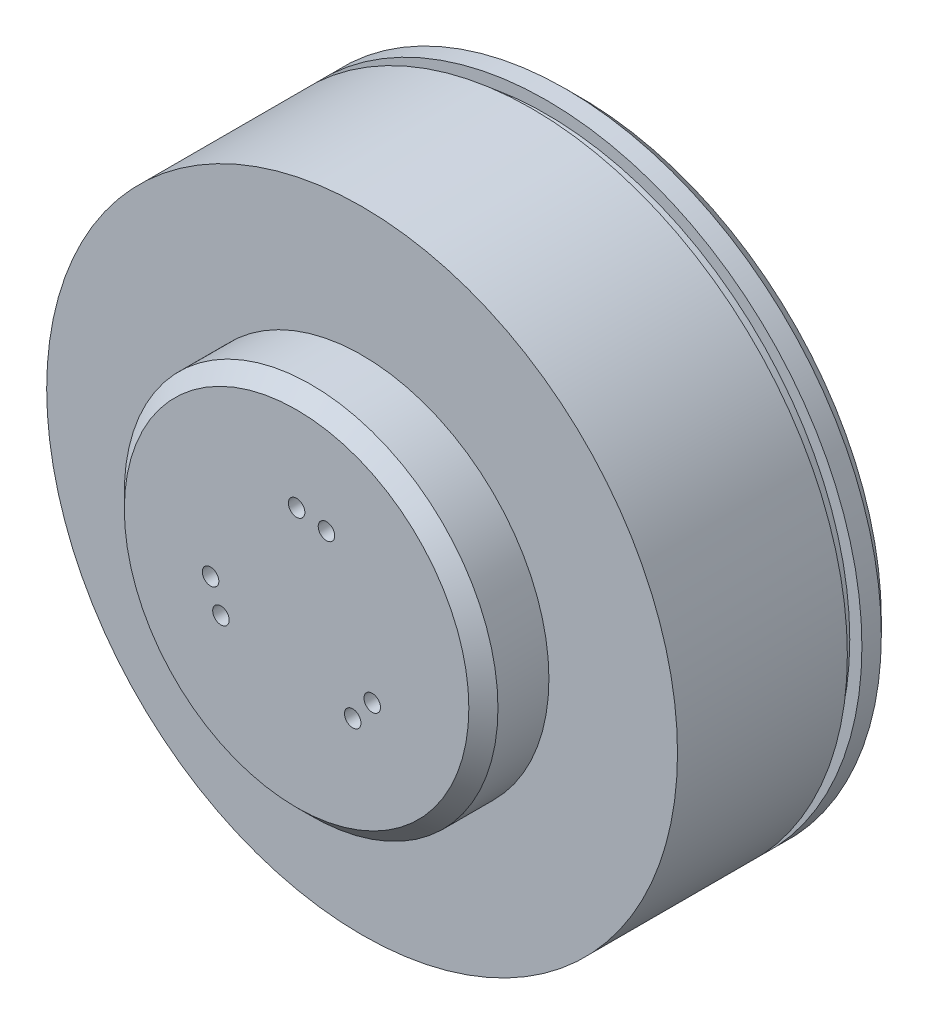
ISO-10303-21;
HEADER;
FILE_DESCRIPTION(('STEP AP214'),'2;1');
FILE_NAME('part.step','',(''),(''),'','','');
FILE_SCHEMA(('AUTOMOTIVE_DESIGN { 1 0 10303 214 1 1 1 1 }'));
ENDSEC;
DATA;
#1=APPLICATION_CONTEXT('core data for automotive mechanical design processes');
#2=APPLICATION_PROTOCOL_DEFINITION('international standard','automotive_design',2000,#1);
#3=PRODUCT_CONTEXT('',#1,'mechanical');
#4=PRODUCT('Part','Part','',(#3));
#5=PRODUCT_RELATED_PRODUCT_CATEGORY('part','',(#4));
#6=PRODUCT_DEFINITION_FORMATION('','',#4);
#7=PRODUCT_DEFINITION_CONTEXT('part definition',#1,'design');
#8=PRODUCT_DEFINITION('design','',#6,#7);
#9=PRODUCT_DEFINITION_SHAPE('','',#8);
#10=(LENGTH_UNIT() NAMED_UNIT(*) SI_UNIT(.MILLI.,.METRE.));
#11=(NAMED_UNIT(*) PLANE_ANGLE_UNIT() SI_UNIT($,.RADIAN.));
#12=(NAMED_UNIT(*) SI_UNIT($,.STERADIAN.) SOLID_ANGLE_UNIT());
#13=UNCERTAINTY_MEASURE_WITH_UNIT(LENGTH_MEASURE(1.E-05),#10,'distance_accuracy_value','');
#14=(GEOMETRIC_REPRESENTATION_CONTEXT(3) GLOBAL_UNCERTAINTY_ASSIGNED_CONTEXT((#13)) GLOBAL_UNIT_ASSIGNED_CONTEXT((#10,
#11,#12)) REPRESENTATION_CONTEXT('',''));
#15=CARTESIAN_POINT('',(0.,0.,0.));
#16=DIRECTION('',(0.,0.,1.));
#17=DIRECTION('',(1.,0.,0.));
#18=AXIS2_PLACEMENT_3D('',#15,#16,#17);
#19=CARTESIAN_POINT('',(-34.4262768246609,1.32819918815126,-286.610981847008));
#20=DIRECTION('',(0.,0.,-1.));
#21=DIRECTION('',(-1.,0.,0.));
#22=AXIS2_PLACEMENT_3D('',#19,#20,#21);
#23=CYLINDRICAL_SURFACE('',#22,130.);
#24=CARTESIAN_POINT('',(-34.4262768246609,1.32819918815126,-370.611081847008));
#25=DIRECTION('',(0.,0.,-1.));
#26=DIRECTION('',(-1.,0.,0.));
#27=AXIS2_PLACEMENT_3D('',#24,#25,#26);
#28=CIRCLE('',#27,130.);
#29=CARTESIAN_POINT('',(-164.426276824661,1.32819918815126,-370.611081847008));
#30=VERTEX_POINT('',#29);
#31=EDGE_CURVE('E11',#30,#30,#28,.F.);
#32=ORIENTED_EDGE('',*,*,#31,.T.);
#33=EDGE_LOOP('',(#32));
#34=FACE_BOUND('',#33,.T.);
#35=CARTESIAN_POINT('',(-34.4262768246609,1.32819918815126,-362.611081847008));
#36=DIRECTION('',(0.,0.,-1.));
#37=DIRECTION('',(-1.,0.,0.));
#38=AXIS2_PLACEMENT_3D('',#35,#36,#37);
#39=CIRCLE('',#38,130.);
#40=CARTESIAN_POINT('',(-164.426276824661,1.32819918815126,-362.611081847008));
#41=VERTEX_POINT('',#40);
#42=EDGE_CURVE('E126',#41,#41,#39,.T.);
#43=ORIENTED_EDGE('',*,*,#42,.T.);
#44=EDGE_LOOP('',(#43));
#45=FACE_BOUND('',#44,.T.);
#46=ADVANCED_FACE('F41',(#34,#45),#23,.T.);
#47=CARTESIAN_POINT('',(-34.4262768246609,1.32819918815126,-376.611081847008));
#48=DIRECTION('',(0.,0.,-1.));
#49=DIRECTION('',(-1.,0.,0.));
#50=AXIS2_PLACEMENT_3D('',#47,#48,#49);
#51=PLANE('',#50);
#52=CARTESIAN_POINT('',(-34.4262768246609,1.32819918815126,-376.611081847008));
#53=DIRECTION('',(0.,0.,-1.));
#54=DIRECTION('',(-1.,0.,0.));
#55=AXIS2_PLACEMENT_3D('',#52,#53,#54);
#56=CIRCLE('',#55,124.);
#57=CARTESIAN_POINT('',(-158.426276824661,1.32819918815126,-376.611081847008));
#58=VERTEX_POINT('',#57);
#59=EDGE_CURVE('E50',#58,#58,#56,.T.);
#60=ORIENTED_EDGE('',*,*,#59,.T.);
#61=EDGE_LOOP('',(#60));
#62=FACE_BOUND('',#61,.T.);
#63=ADVANCED_FACE('F140',(#62),#51,.T.);
#64=CARTESIAN_POINT('',(-34.4262768246609,1.32819918815126,-362.611081847008));
#65=DIRECTION('',(0.,0.,-1.));
#66=DIRECTION('',(-1.,0.,0.));
#67=AXIS2_PLACEMENT_3D('',#64,#65,#66);
#68=PLANE('',#67);
#69=ORIENTED_EDGE('',*,*,#42,.F.);
#70=EDGE_LOOP('',(#69));
#71=FACE_BOUND('',#70,.T.);
#72=CARTESIAN_POINT('',(-34.4262768246608,1.3281991881513,-362.611081847008));
#73=DIRECTION('',(0.,0.,-1.));
#74=DIRECTION('',(-1.,0.,0.));
#75=AXIS2_PLACEMENT_3D('',#72,#73,#74);
#76=CIRCLE('',#75,125.);
#77=CARTESIAN_POINT('',(-159.426276824661,1.3281991881513,-362.611081847008));
#78=VERTEX_POINT('',#77);
#79=EDGE_CURVE('E120',#78,#78,#76,.T.);
#80=ORIENTED_EDGE('',*,*,#79,.T.);
#81=EDGE_LOOP('',(#80));
#82=FACE_BOUND('',#81,.T.);
#83=ADVANCED_FACE('F157',(#71,#82),#68,.F.);
#84=CARTESIAN_POINT('',(-34.4262768246609,1.32819918815126,-356.611081847008));
#85=DIRECTION('',(0.,0.,-1.));
#86=DIRECTION('',(-1.,0.,0.));
#87=AXIS2_PLACEMENT_3D('',#84,#85,#86);
#88=PLANE('',#87);
#89=CARTESIAN_POINT('',(-34.4262768246609,1.32819918815126,-356.611081847008));
#90=DIRECTION('',(0.,0.,-1.));
#91=DIRECTION('',(-1.,0.,0.));
#92=AXIS2_PLACEMENT_3D('',#89,#90,#91);
#93=CIRCLE('',#92,130.);
#94=CARTESIAN_POINT('',(-164.426276824661,1.32819918815126,-356.611081847008));
#95=VERTEX_POINT('',#94);
#96=EDGE_CURVE('E123',#95,#95,#93,.T.);
#97=ORIENTED_EDGE('',*,*,#96,.T.);
#98=EDGE_LOOP('',(#97));
#99=FACE_BOUND('',#98,.T.);
#100=CARTESIAN_POINT('',(-34.4262768246608,1.3281991881513,-356.611081847008));
#101=DIRECTION('',(0.,0.,-1.));
#102=DIRECTION('',(-1.,0.,0.));
#103=AXIS2_PLACEMENT_3D('',#100,#101,#102);
#104=CIRCLE('',#103,125.);
#105=CARTESIAN_POINT('',(-159.426276824661,1.3281991881513,-356.611081847008));
#106=VERTEX_POINT('',#105);
#107=EDGE_CURVE('E114',#106,#106,#104,.T.);
#108=ORIENTED_EDGE('',*,*,#107,.F.);
#109=EDGE_LOOP('',(#108));
#110=FACE_BOUND('',#109,.T.);
#111=ADVANCED_FACE('F178',(#99,#110),#88,.T.);
#112=CARTESIAN_POINT('',(-34.4262768246608,1.3281991881513,-362.611081847008));
#113=DIRECTION('',(0.,0.,1.));
#114=DIRECTION('',(1.,0.,0.));
#115=AXIS2_PLACEMENT_3D('',#112,#113,#114);
#116=CYLINDRICAL_SURFACE('',#115,125.);
#117=ORIENTED_EDGE('',*,*,#79,.F.);
#118=EDGE_LOOP('',(#117));
#119=FACE_BOUND('',#118,.T.);
#120=ORIENTED_EDGE('',*,*,#107,.T.);
#121=EDGE_LOOP('',(#120));
#122=FACE_BOUND('',#121,.T.);
#123=ADVANCED_FACE('F172',(#119,#122),#116,.T.);
#124=CARTESIAN_POINT('',(-34.4262768246609,1.32819918815126,-286.610981847008));
#125=DIRECTION('',(0.,0.,-1.));
#126=DIRECTION('',(-1.,0.,0.));
#127=AXIS2_PLACEMENT_3D('',#124,#125,#126);
#128=PLANE('',#127);
#129=CARTESIAN_POINT('',(-34.4262768246608,1.3281991881513,-286.610981847008));
#130=DIRECTION('',(0.,0.,1.));
#131=DIRECTION('',(1.,0.,0.));
#132=AXIS2_PLACEMENT_3D('',#129,#130,#131);
#133=CIRCLE('',#132,77.);
#134=CARTESIAN_POINT('',(42.5737231753392,1.3281991881513,-286.610981847008));
#135=VERTEX_POINT('',#134);
#136=EDGE_CURVE('E115',#135,#135,#133,.T.);
#137=ORIENTED_EDGE('',*,*,#136,.F.);
#138=EDGE_LOOP('',(#137));
#139=FACE_BOUND('',#138,.T.);
#140=CARTESIAN_POINT('',(-34.4262768246609,1.32819918815126,-286.610981847008));
#141=DIRECTION('',(0.,0.,-1.));
#142=DIRECTION('',(-1.,0.,0.));
#143=AXIS2_PLACEMENT_3D('',#140,#141,#142);
#144=CIRCLE('',#143,130.);
#145=CARTESIAN_POINT('',(-164.426276824661,1.32819918815126,-286.610981847008));
#146=VERTEX_POINT('',#145);
#147=EDGE_CURVE('E119',#146,#146,#144,.T.);
#148=ORIENTED_EDGE('',*,*,#147,.F.);
#149=EDGE_LOOP('',(#148));
#150=FACE_BOUND('',#149,.T.);
#151=ADVANCED_FACE('F163',(#139,#150),#128,.F.);
#152=ORIENTED_EDGE('',*,*,#147,.T.);
#153=EDGE_LOOP('',(#152));
#154=FACE_BOUND('',#153,.T.);
#155=ORIENTED_EDGE('',*,*,#96,.F.);
#156=EDGE_LOOP('',(#155));
#157=FACE_BOUND('',#156,.T.);
#158=ADVANCED_FACE('F153',(#154,#157),#23,.T.);
#159=CARTESIAN_POINT('',(-34.4262768246608,1.3281991881513,-41.8221932415516));
#160=DIRECTION('',(0.,0.,-1.));
#161=DIRECTION('',(-1.,0.,0.));
#162=AXIS2_PLACEMENT_3D('',#159,#160,#161);
#163=CYLINDRICAL_SURFACE('',#162,77.);
#164=CARTESIAN_POINT('',(-34.4262768246608,1.3281991881513,-265.611081847008));
#165=DIRECTION('',(0.,0.,1.));
#166=DIRECTION('',(1.,0.,0.));
#167=AXIS2_PLACEMENT_3D('',#164,#165,#166);
#168=CIRCLE('',#167,77.);
#169=CARTESIAN_POINT('',(42.5737231753392,1.3281991881513,-265.611081847008));
#170=VERTEX_POINT('',#169);
#171=EDGE_CURVE('E135',#170,#170,#168,.F.);
#172=ORIENTED_EDGE('',*,*,#171,.T.);
#173=EDGE_LOOP('',(#172));
#174=FACE_BOUND('',#173,.T.);
#175=ORIENTED_EDGE('',*,*,#136,.T.);
#176=EDGE_LOOP('',(#175));
#177=FACE_BOUND('',#176,.T.);
#178=ADVANCED_FACE('F162',(#174,#177),#163,.T.);
#179=CARTESIAN_POINT('',(-34.426276824661,1.3281991881512,-259.611081847008));
#180=DIRECTION('',(0.,0.,1.));
#181=DIRECTION('',(0.142159037104617,0.989843830192161,0.));
#182=AXIS2_PLACEMENT_3D('',#179,#180,#181);
#183=PLANE('',#182);
#184=CARTESIAN_POINT('',(-34.4262768246608,1.3281991881513,-259.611081847008));
#185=DIRECTION('',(0.,0.,1.));
#186=DIRECTION('',(1.,0.,0.));
#187=AXIS2_PLACEMENT_3D('',#184,#185,#186);
#188=CIRCLE('',#187,70.9999999999999);
#189=CARTESIAN_POINT('',(36.5737231753391,1.3281991881513,-259.611081847008));
#190=VERTEX_POINT('',#189);
#191=EDGE_CURVE('E118',#190,#190,#188,.T.);
#192=ORIENTED_EDGE('',*,*,#191,.T.);
#193=EDGE_LOOP('',(#192));
#194=FACE_BOUND('',#193,.T.);
#195=CARTESIAN_POINT('',(-34.4262768246608,37.3281991881513,-259.611081847008));
#196=DIRECTION('',(0.,0.,1.));
#197=DIRECTION('',(1.,0.,0.));
#198=AXIS2_PLACEMENT_3D('',#195,#196,#197);
#199=CIRCLE('',#198,3.4);
#200=CARTESIAN_POINT('',(-31.0262768246608,37.3281991881513,-259.611081847008));
#201=VERTEX_POINT('',#200);
#202=EDGE_CURVE('E80',#201,#201,#199,.T.);
#203=ORIENTED_EDGE('',*,*,#202,.F.);
#204=EDGE_LOOP('',(#203));
#205=FACE_BOUND('',#204,.T.);
#206=CARTESIAN_POINT('',(-22.1135516649436,35.1571335364465,-259.611081847008));
#207=DIRECTION('',(0.,0.,1.));
#208=DIRECTION('',(1.,0.,0.));
#209=AXIS2_PLACEMENT_3D('',#206,#207,#208);
#210=CIRCLE('',#209,3.4);
#211=CARTESIAN_POINT('',(-18.7135516649436,35.1571335364465,-259.611081847008));
#212=VERTEX_POINT('',#211);
#213=EDGE_CURVE('E79',#212,#212,#210,.T.);
#214=ORIENTED_EDGE('',*,*,#213,.F.);
#215=EDGE_LOOP('',(#214));
#216=FACE_BOUND('',#215,.T.);
#217=CARTESIAN_POINT('',(-3.24936228841936,-16.6718008118486,-259.611081847008));
#218=DIRECTION('',(0.,0.,1.));
#219=DIRECTION('',(1.,0.,0.));
#220=AXIS2_PLACEMENT_3D('',#217,#218,#219);
#221=CIRCLE('',#220,3.4);
#222=CARTESIAN_POINT('',(0.15063771158064,-16.6718008118486,-259.611081847008));
#223=VERTEX_POINT('',#222);
#224=EDGE_CURVE('E90',#223,#223,#221,.T.);
#225=ORIENTED_EDGE('',*,*,#224,.F.);
#226=EDGE_LOOP('',(#225));
#227=FACE_BOUND('',#226,.T.);
#228=CARTESIAN_POINT('',(-11.2859228759382,-26.249400764127,-259.611081847008));
#229=DIRECTION('',(0.,0.,1.));
#230=DIRECTION('',(1.,0.,0.));
#231=AXIS2_PLACEMENT_3D('',#228,#229,#230);
#232=CIRCLE('',#231,3.4);
#233=CARTESIAN_POINT('',(-7.88592287593818,-26.249400764127,-259.611081847008));
#234=VERTEX_POINT('',#233);
#235=EDGE_CURVE('E96',#234,#234,#232,.T.);
#236=ORIENTED_EDGE('',*,*,#235,.F.);
#237=EDGE_LOOP('',(#236));
#238=FACE_BOUND('',#237,.T.);
#239=CARTESIAN_POINT('',(-65.6031913608997,-16.6718008118498,-259.611081847008));
#240=DIRECTION('',(0.,0.,1.));
#241=DIRECTION('',(1.,0.,0.));
#242=AXIS2_PLACEMENT_3D('',#239,#240,#241);
#243=CIRCLE('',#242,3.4);
#244=CARTESIAN_POINT('',(-62.2031913608997,-16.6718008118498,-259.611081847008));
#245=VERTEX_POINT('',#244);
#246=EDGE_CURVE('E102',#245,#245,#243,.T.);
#247=ORIENTED_EDGE('',*,*,#246,.F.);
#248=EDGE_LOOP('',(#247));
#249=FACE_BOUND('',#248,.T.);
#250=CARTESIAN_POINT('',(-69.879355933098,-4.9231352078664,-259.611081847008));
#251=DIRECTION('',(0.,0.,1.));
#252=DIRECTION('',(1.,0.,0.));
#253=AXIS2_PLACEMENT_3D('',#250,#251,#252);
#254=CIRCLE('',#253,3.4);
#255=CARTESIAN_POINT('',(-66.479355933098,-4.9231352078664,-259.611081847008));
#256=VERTEX_POINT('',#255);
#257=EDGE_CURVE('E108',#256,#256,#254,.T.);
#258=ORIENTED_EDGE('',*,*,#257,.F.);
#259=EDGE_LOOP('',(#258));
#260=FACE_BOUND('',#259,.T.);
#261=ADVANCED_FACE('F169',(#194,#205,#216,#227,#238,#249,#260),#183,.T.);
#262=CARTESIAN_POINT('',(-69.879355933098,-4.9231352078664,-279.361081847008));
#263=DIRECTION('',(0.,0.,1.));
#264=DIRECTION('',(1.,0.,0.));
#265=AXIS2_PLACEMENT_3D('',#262,#263,#264);
#266=CONICAL_SURFACE('',#265,3.4,1.02974425867666);
#267=CARTESIAN_POINT('',(-69.879355933098,-4.9231352078664,-281.404007951702));
#268=VERTEX_POINT('',#267);
#269=VERTEX_LOOP('',#268);
#270=FACE_BOUND('',#269,.T.);
#271=CARTESIAN_POINT('',(-69.879355933098,-4.9231352078664,-279.361081847008));
#272=DIRECTION('',(0.,0.,1.));
#273=DIRECTION('',(1.,0.,0.));
#274=AXIS2_PLACEMENT_3D('',#271,#272,#273);
#275=CIRCLE('',#274,3.4);
#276=CARTESIAN_POINT('',(-66.479355933098,-4.9231352078664,-279.361081847008));
#277=VERTEX_POINT('',#276);
#278=EDGE_CURVE('E111',#277,#277,#275,.T.);
#279=ORIENTED_EDGE('',*,*,#278,.T.);
#280=EDGE_LOOP('',(#279));
#281=FACE_BOUND('',#280,.T.);
#282=ADVANCED_FACE('F226',(#270,#281),#266,.F.);
#283=CARTESIAN_POINT('',(-69.879355933098,-4.9231352078664,-259.611081847008));
#284=DIRECTION('',(0.,0.,1.));
#285=DIRECTION('',(1.,0.,0.));
#286=AXIS2_PLACEMENT_3D('',#283,#284,#285);
#287=CYLINDRICAL_SURFACE('',#286,3.4);
#288=ORIENTED_EDGE('',*,*,#278,.F.);
#289=EDGE_LOOP('',(#288));
#290=FACE_BOUND('',#289,.T.);
#291=ORIENTED_EDGE('',*,*,#257,.T.);
#292=EDGE_LOOP('',(#291));
#293=FACE_BOUND('',#292,.T.);
#294=ADVANCED_FACE('F231',(#290,#293),#287,.F.);
#295=CARTESIAN_POINT('',(-65.6031913608997,-16.6718008118498,-279.361081847008));
#296=DIRECTION('',(0.,0.,1.));
#297=DIRECTION('',(1.,0.,0.));
#298=AXIS2_PLACEMENT_3D('',#295,#296,#297);
#299=CONICAL_SURFACE('',#298,3.39999999999999,1.02974425867665);
#300=CARTESIAN_POINT('',(-65.6031913608997,-16.6718008118498,-281.404007951702));
#301=VERTEX_POINT('',#300);
#302=VERTEX_LOOP('',#301);
#303=FACE_BOUND('',#302,.T.);
#304=CARTESIAN_POINT('',(-65.6031913608997,-16.6718008118498,-279.361081847008));
#305=DIRECTION('',(0.,0.,1.));
#306=DIRECTION('',(1.,0.,0.));
#307=AXIS2_PLACEMENT_3D('',#304,#305,#306);
#308=CIRCLE('',#307,3.39999999999999);
#309=CARTESIAN_POINT('',(-62.2031913608997,-16.6718008118498,-279.361081847008));
#310=VERTEX_POINT('',#309);
#311=EDGE_CURVE('E105',#310,#310,#308,.T.);
#312=ORIENTED_EDGE('',*,*,#311,.T.);
#313=EDGE_LOOP('',(#312));
#314=FACE_BOUND('',#313,.T.);
#315=ADVANCED_FACE('F243',(#303,#314),#299,.F.);
#316=CARTESIAN_POINT('',(-65.6031913608997,-16.6718008118498,-259.611081847008));
#317=DIRECTION('',(0.,0.,1.));
#318=DIRECTION('',(1.,0.,0.));
#319=AXIS2_PLACEMENT_3D('',#316,#317,#318);
#320=CYLINDRICAL_SURFACE('',#319,3.4);
#321=ORIENTED_EDGE('',*,*,#311,.F.);
#322=EDGE_LOOP('',(#321));
#323=FACE_BOUND('',#322,.T.);
#324=ORIENTED_EDGE('',*,*,#246,.T.);
#325=EDGE_LOOP('',(#324));
#326=FACE_BOUND('',#325,.T.);
#327=ADVANCED_FACE('F256',(#323,#326),#320,.F.);
#328=CARTESIAN_POINT('',(-11.2859228759382,-26.249400764127,-279.361081847008));
#329=DIRECTION('',(0.,0.,1.));
#330=DIRECTION('',(1.,0.,0.));
#331=AXIS2_PLACEMENT_3D('',#328,#329,#330);
#332=CONICAL_SURFACE('',#331,3.39999999999999,1.02974425867665);
#333=CARTESIAN_POINT('',(-11.2859228759382,-26.249400764127,-281.404007951702));
#334=VERTEX_POINT('',#333);
#335=VERTEX_LOOP('',#334);
#336=FACE_BOUND('',#335,.T.);
#337=CARTESIAN_POINT('',(-11.2859228759382,-26.249400764127,-279.361081847008));
#338=DIRECTION('',(0.,0.,1.));
#339=DIRECTION('',(1.,0.,0.));
#340=AXIS2_PLACEMENT_3D('',#337,#338,#339);
#341=CIRCLE('',#340,3.39999999999999);
#342=CARTESIAN_POINT('',(-7.88592287593819,-26.249400764127,-279.361081847008));
#343=VERTEX_POINT('',#342);
#344=EDGE_CURVE('E99',#343,#343,#341,.T.);
#345=ORIENTED_EDGE('',*,*,#344,.T.);
#346=EDGE_LOOP('',(#345));
#347=FACE_BOUND('',#346,.T.);
#348=ADVANCED_FACE('F265',(#336,#347),#332,.F.);
#349=CARTESIAN_POINT('',(-11.2859228759382,-26.249400764127,-259.611081847008));
#350=DIRECTION('',(0.,0.,1.));
#351=DIRECTION('',(1.,0.,0.));
#352=AXIS2_PLACEMENT_3D('',#349,#350,#351);
#353=CYLINDRICAL_SURFACE('',#352,3.4);
#354=ORIENTED_EDGE('',*,*,#344,.F.);
#355=EDGE_LOOP('',(#354));
#356=FACE_BOUND('',#355,.T.);
#357=ORIENTED_EDGE('',*,*,#235,.T.);
#358=EDGE_LOOP('',(#357));
#359=FACE_BOUND('',#358,.T.);
#360=ADVANCED_FACE('F277',(#356,#359),#353,.F.);
#361=CARTESIAN_POINT('',(-3.24936228841936,-16.6718008118486,-279.361081847008));
#362=DIRECTION('',(0.,0.,1.));
#363=DIRECTION('',(1.,0.,0.));
#364=AXIS2_PLACEMENT_3D('',#361,#362,#363);
#365=CONICAL_SURFACE('',#364,3.39999999999999,1.02974425867665);
#366=CARTESIAN_POINT('',(-3.24936228841936,-16.6718008118486,-281.404007951702));
#367=VERTEX_POINT('',#366);
#368=VERTEX_LOOP('',#367);
#369=FACE_BOUND('',#368,.T.);
#370=CARTESIAN_POINT('',(-3.24936228841936,-16.6718008118486,-279.361081847008));
#371=DIRECTION('',(0.,0.,1.));
#372=DIRECTION('',(1.,0.,0.));
#373=AXIS2_PLACEMENT_3D('',#370,#371,#372);
#374=CIRCLE('',#373,3.39999999999999);
#375=CARTESIAN_POINT('',(0.150637711580638,-16.6718008118486,-279.361081847008));
#376=VERTEX_POINT('',#375);
#377=EDGE_CURVE('E93',#376,#376,#374,.T.);
#378=ORIENTED_EDGE('',*,*,#377,.T.);
#379=EDGE_LOOP('',(#378));
#380=FACE_BOUND('',#379,.T.);
#381=ADVANCED_FACE('F287',(#369,#380),#365,.F.);
#382=CARTESIAN_POINT('',(-3.24936228841936,-16.6718008118486,-259.611081847008));
#383=DIRECTION('',(0.,0.,1.));
#384=DIRECTION('',(1.,0.,0.));
#385=AXIS2_PLACEMENT_3D('',#382,#383,#384);
#386=CYLINDRICAL_SURFACE('',#385,3.4);
#387=ORIENTED_EDGE('',*,*,#377,.F.);
#388=EDGE_LOOP('',(#387));
#389=FACE_BOUND('',#388,.T.);
#390=ORIENTED_EDGE('',*,*,#224,.T.);
#391=EDGE_LOOP('',(#390));
#392=FACE_BOUND('',#391,.T.);
#393=ADVANCED_FACE('F299',(#389,#392),#386,.F.);
#394=CARTESIAN_POINT('',(-22.1135516649436,35.1571335364465,-279.361081847008));
#395=DIRECTION('',(0.,0.,1.));
#396=DIRECTION('',(1.,0.,0.));
#397=AXIS2_PLACEMENT_3D('',#394,#395,#396);
#398=CONICAL_SURFACE('',#397,3.39999999999999,1.02974425867665);
#399=CARTESIAN_POINT('',(-22.1135516649436,35.1571335364465,-281.404007951702));
#400=VERTEX_POINT('',#399);
#401=VERTEX_LOOP('',#400);
#402=FACE_BOUND('',#401,.T.);
#403=CARTESIAN_POINT('',(-22.1135516649436,35.1571335364465,-279.361081847008));
#404=DIRECTION('',(0.,0.,1.));
#405=DIRECTION('',(1.,0.,0.));
#406=AXIS2_PLACEMENT_3D('',#403,#404,#405);
#407=CIRCLE('',#406,3.39999999999999);
#408=CARTESIAN_POINT('',(-18.7135516649436,35.1571335364465,-279.361081847008));
#409=VERTEX_POINT('',#408);
#410=EDGE_CURVE('E83',#409,#409,#407,.T.);
#411=ORIENTED_EDGE('',*,*,#410,.T.);
#412=EDGE_LOOP('',(#411));
#413=FACE_BOUND('',#412,.T.);
#414=ADVANCED_FACE('F309',(#402,#413),#398,.F.);
#415=CARTESIAN_POINT('',(-22.1135516649436,35.1571335364465,-259.611081847008));
#416=DIRECTION('',(0.,0.,1.));
#417=DIRECTION('',(1.,0.,0.));
#418=AXIS2_PLACEMENT_3D('',#415,#416,#417);
#419=CYLINDRICAL_SURFACE('',#418,3.4);
#420=ORIENTED_EDGE('',*,*,#410,.F.);
#421=EDGE_LOOP('',(#420));
#422=FACE_BOUND('',#421,.T.);
#423=ORIENTED_EDGE('',*,*,#213,.T.);
#424=EDGE_LOOP('',(#423));
#425=FACE_BOUND('',#424,.T.);
#426=ADVANCED_FACE('F73',(#422,#425),#419,.F.);
#427=CARTESIAN_POINT('',(-34.4262768246608,37.3281991881513,-279.361081847008));
#428=DIRECTION('',(0.,0.,1.));
#429=DIRECTION('',(1.,0.,0.));
#430=AXIS2_PLACEMENT_3D('',#427,#428,#429);
#431=CONICAL_SURFACE('',#430,3.39999999999999,1.02974425867665);
#432=CARTESIAN_POINT('',(-34.4262768246608,37.3281991881513,-281.404007951702));
#433=VERTEX_POINT('',#432);
#434=VERTEX_LOOP('',#433);
#435=FACE_BOUND('',#434,.T.);
#436=CARTESIAN_POINT('',(-34.4262768246608,37.3281991881513,-279.361081847008));
#437=DIRECTION('',(0.,0.,1.));
#438=DIRECTION('',(1.,0.,0.));
#439=AXIS2_PLACEMENT_3D('',#436,#437,#438);
#440=CIRCLE('',#439,3.39999999999999);
#441=CARTESIAN_POINT('',(-31.0262768246608,37.3281991881513,-279.361081847008));
#442=VERTEX_POINT('',#441);
#443=EDGE_CURVE('E77',#442,#442,#440,.T.);
#444=ORIENTED_EDGE('',*,*,#443,.T.);
#445=EDGE_LOOP('',(#444));
#446=FACE_BOUND('',#445,.T.);
#447=ADVANCED_FACE('F69',(#435,#446),#431,.F.);
#448=CARTESIAN_POINT('',(-34.4262768246608,37.3281991881513,-259.611081847008));
#449=DIRECTION('',(0.,0.,1.));
#450=DIRECTION('',(1.,0.,0.));
#451=AXIS2_PLACEMENT_3D('',#448,#449,#450);
#452=CYLINDRICAL_SURFACE('',#451,3.4);
#453=ORIENTED_EDGE('',*,*,#443,.F.);
#454=EDGE_LOOP('',(#453));
#455=FACE_BOUND('',#454,.T.);
#456=ORIENTED_EDGE('',*,*,#202,.T.);
#457=EDGE_LOOP('',(#456));
#458=FACE_BOUND('',#457,.T.);
#459=ADVANCED_FACE('F72',(#455,#458),#452,.F.);
#460=CARTESIAN_POINT('',(-34.4262768246608,1.3281991881513,-259.611081847008));
#461=DIRECTION('',(0.,0.,-1.));
#462=DIRECTION('',(-1.,0.,0.));
#463=AXIS2_PLACEMENT_3D('',#460,#461,#462);
#464=CONICAL_SURFACE('',#463,70.9999999999999,0.785398163397451);
#465=ORIENTED_EDGE('',*,*,#171,.F.);
#466=EDGE_LOOP('',(#465));
#467=FACE_BOUND('',#466,.T.);
#468=ORIENTED_EDGE('',*,*,#191,.F.);
#469=EDGE_LOOP('',(#468));
#470=FACE_BOUND('',#469,.T.);
#471=ADVANCED_FACE('F143',(#467,#470),#464,.T.);
#472=CARTESIAN_POINT('',(-34.4262768246609,1.32819918815126,-376.611081847008));
#473=DIRECTION('',(0.,0.,1.));
#474=DIRECTION('',(1.,0.,0.));
#475=AXIS2_PLACEMENT_3D('',#472,#473,#474);
#476=CONICAL_SURFACE('',#475,124.,0.785398163397448);
#477=ORIENTED_EDGE('',*,*,#31,.F.);
#478=EDGE_LOOP('',(#477));
#479=FACE_BOUND('',#478,.T.);
#480=ORIENTED_EDGE('',*,*,#59,.F.);
#481=EDGE_LOOP('',(#480));
#482=FACE_BOUND('',#481,.T.);
#483=ADVANCED_FACE('F44',(#479,#482),#476,.T.);
#484=CLOSED_SHELL('',(#46,#63,#83,#111,#123,#151,#158,#178,#261,#282,#294,#315,#327,#348,#360,
#381,#393,#414,#426,#447,#459,#471,#483));
#485=MANIFOLD_SOLID_BREP('B2',#484);
#486=ADVANCED_BREP_SHAPE_REPRESENTATION('',(#18,#485),#14);
#487=SHAPE_DEFINITION_REPRESENTATION(#9,#486);
ENDSEC;
END-ISO-10303-21;
